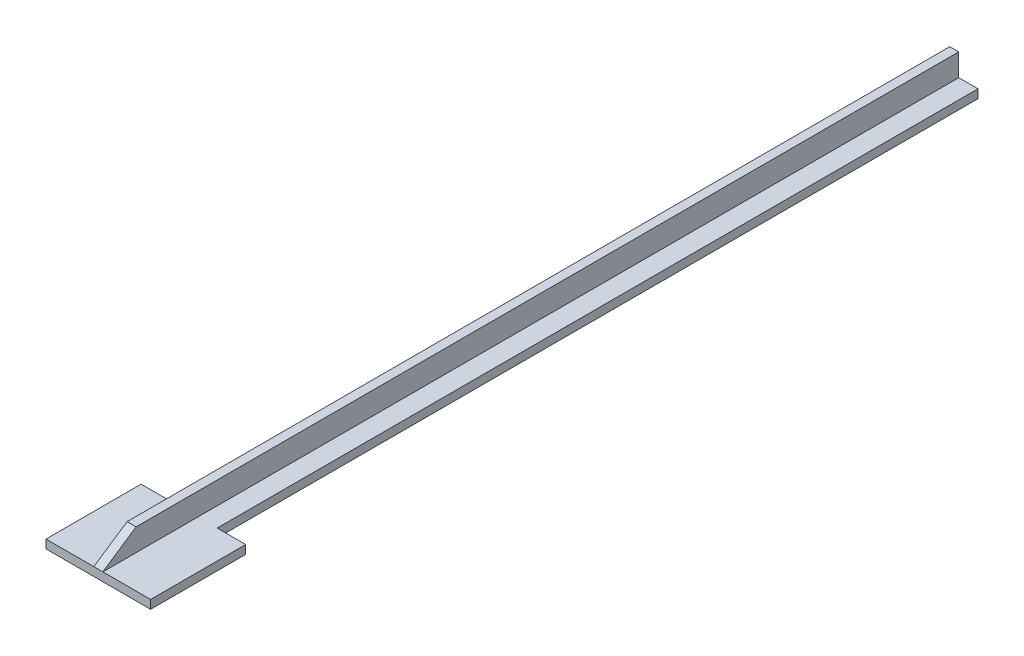
ISO-10303-21;
HEADER;
FILE_DESCRIPTION(('STEP AP214'),'2;1');
FILE_NAME('part.step','',(''),(''),'','','');
FILE_SCHEMA(('AUTOMOTIVE_DESIGN { 1 0 10303 214 1 1 1 1 }'));
ENDSEC;
DATA;
#1=APPLICATION_CONTEXT('core data for automotive mechanical design processes');
#2=APPLICATION_PROTOCOL_DEFINITION('international standard','automotive_design',2000,#1);
#3=PRODUCT_CONTEXT('',#1,'mechanical');
#4=PRODUCT('Part','Part','',(#3));
#5=PRODUCT_RELATED_PRODUCT_CATEGORY('part','',(#4));
#6=PRODUCT_DEFINITION_FORMATION('','',#4);
#7=PRODUCT_DEFINITION_CONTEXT('part definition',#1,'design');
#8=PRODUCT_DEFINITION('design','',#6,#7);
#9=PRODUCT_DEFINITION_SHAPE('','',#8);
#10=(LENGTH_UNIT() NAMED_UNIT(*) SI_UNIT(.MILLI.,.METRE.));
#11=(NAMED_UNIT(*) PLANE_ANGLE_UNIT() SI_UNIT($,.RADIAN.));
#12=(NAMED_UNIT(*) SI_UNIT($,.STERADIAN.) SOLID_ANGLE_UNIT());
#13=UNCERTAINTY_MEASURE_WITH_UNIT(LENGTH_MEASURE(1.E-05),#10,'distance_accuracy_value','');
#14=(GEOMETRIC_REPRESENTATION_CONTEXT(3) GLOBAL_UNCERTAINTY_ASSIGNED_CONTEXT((#13)) GLOBAL_UNIT_ASSIGNED_CONTEXT((#10,
#11,#12)) REPRESENTATION_CONTEXT('',''));
#15=CARTESIAN_POINT('',(0.,0.,0.));
#16=DIRECTION('',(0.,0.,1.));
#17=DIRECTION('',(1.,0.,0.));
#18=AXIS2_PLACEMENT_3D('',#15,#16,#17);
#19=CARTESIAN_POINT('',(10.,0.,180.));
#20=DIRECTION('',(-1.,0.,0.));
#21=DIRECTION('',(0.,0.,1.));
#22=AXIS2_PLACEMENT_3D('',#19,#20,#21);
#23=PLANE('',#22);
#24=DIRECTION('',(0.,1.,0.));
#25=VECTOR('',#24,1.);
#26=CARTESIAN_POINT('',(10.,0.,160.));
#27=LINE('',#26,#25);
#28=CARTESIAN_POINT('',(10.,0.,160.));
#29=VERTEX_POINT('',#28);
#30=CARTESIAN_POINT('',(10.,1.8,160.));
#31=VERTEX_POINT('',#30);
#32=EDGE_CURVE('E162',#29,#31,#27,.T.);
#33=ORIENTED_EDGE('',*,*,#32,.F.);
#34=DIRECTION('',(0.,0.,-1.));
#35=VECTOR('',#34,1.);
#36=CARTESIAN_POINT('',(10.,0.,180.));
#37=LINE('',#36,#35);
#38=CARTESIAN_POINT('',(10.,0.,0.));
#39=VERTEX_POINT('',#38);
#40=EDGE_CURVE('E208',#29,#39,#37,.T.);
#41=ORIENTED_EDGE('',*,*,#40,.T.);
#42=DIRECTION('',(0.,1.,0.));
#43=VECTOR('',#42,1.);
#44=CARTESIAN_POINT('',(10.,0.,0.));
#45=LINE('',#44,#43);
#46=CARTESIAN_POINT('',(10.,1.8,0.));
#47=VERTEX_POINT('',#46);
#48=EDGE_CURVE('E176',#39,#47,#45,.T.);
#49=ORIENTED_EDGE('',*,*,#48,.T.);
#50=DIRECTION('',(0.,0.,-1.));
#51=VECTOR('',#50,1.);
#52=CARTESIAN_POINT('',(10.,1.8,180.));
#53=LINE('',#52,#51);
#54=EDGE_CURVE('E206',#31,#47,#53,.T.);
#55=ORIENTED_EDGE('',*,*,#54,.F.);
#56=EDGE_LOOP('',(#33,#41,#49,#55));
#57=FACE_BOUND('',#56,.T.);
#58=ADVANCED_FACE('F35',(#57),#23,.F.);
#59=CARTESIAN_POINT('',(0.,0.,180.));
#60=DIRECTION('',(-1.,0.,0.));
#61=DIRECTION('',(0.,0.,1.));
#62=AXIS2_PLACEMENT_3D('',#59,#60,#61);
#63=PLANE('',#62);
#64=DIRECTION('',(0.,0.,-1.));
#65=VECTOR('',#64,1.);
#66=CARTESIAN_POINT('',(0.,0.,180.));
#67=LINE('',#66,#65);
#68=CARTESIAN_POINT('',(0.,0.,160.));
#69=VERTEX_POINT('',#68);
#70=CARTESIAN_POINT('',(0.,0.,0.));
#71=VERTEX_POINT('',#70);
#72=EDGE_CURVE('E194',#69,#71,#67,.T.);
#73=ORIENTED_EDGE('',*,*,#72,.F.);
#74=DIRECTION('',(0.,1.,0.));
#75=VECTOR('',#74,1.);
#76=CARTESIAN_POINT('',(0.,0.,160.));
#77=LINE('',#76,#75);
#78=CARTESIAN_POINT('',(0.,1.8,160.));
#79=VERTEX_POINT('',#78);
#80=EDGE_CURVE('E141',#69,#79,#77,.T.);
#81=ORIENTED_EDGE('',*,*,#80,.T.);
#82=DIRECTION('',(0.,0.,-1.));
#83=VECTOR('',#82,1.);
#84=CARTESIAN_POINT('',(0.,1.8,180.));
#85=LINE('',#84,#83);
#86=CARTESIAN_POINT('',(0.,1.8,0.));
#87=VERTEX_POINT('',#86);
#88=EDGE_CURVE('E196',#79,#87,#85,.T.);
#89=ORIENTED_EDGE('',*,*,#88,.T.);
#90=DIRECTION('',(0.,1.,0.));
#91=VECTOR('',#90,1.);
#92=CARTESIAN_POINT('',(0.,0.,0.));
#93=LINE('',#92,#91);
#94=EDGE_CURVE('E171',#71,#87,#93,.T.);
#95=ORIENTED_EDGE('',*,*,#94,.F.);
#96=EDGE_LOOP('',(#73,#81,#89,#95));
#97=FACE_BOUND('',#96,.T.);
#98=ADVANCED_FACE('F256',(#97),#63,.T.);
#99=CARTESIAN_POINT('',(0.,0.,180.));
#100=DIRECTION('',(0.,1.,0.));
#101=DIRECTION('',(0.,0.,1.));
#102=AXIS2_PLACEMENT_3D('',#99,#100,#101);
#103=PLANE('',#102);
#104=DIRECTION('',(1.,0.,0.));
#105=VECTOR('',#104,1.);
#106=CARTESIAN_POINT('',(0.,0.,180.));
#107=LINE('',#106,#105);
#108=CARTESIAN_POINT('',(-6.,0.,180.));
#109=VERTEX_POINT('',#108);
#110=CARTESIAN_POINT('',(16.,0.,180.));
#111=VERTEX_POINT('',#110);
#112=EDGE_CURVE('E127',#109,#111,#107,.T.);
#113=ORIENTED_EDGE('',*,*,#112,.F.);
#114=DIRECTION('',(0.,0.,1.));
#115=VECTOR('',#114,1.);
#116=CARTESIAN_POINT('',(-6.,0.,160.));
#117=LINE('',#116,#115);
#118=CARTESIAN_POINT('',(-6.,0.,160.));
#119=VERTEX_POINT('',#118);
#120=EDGE_CURVE('E122',#119,#109,#117,.T.);
#121=ORIENTED_EDGE('',*,*,#120,.F.);
#122=DIRECTION('',(1.,0.,0.));
#123=VECTOR('',#122,1.);
#124=CARTESIAN_POINT('',(-6.,0.,160.));
#125=LINE('',#124,#123);
#126=EDGE_CURVE('E125',#119,#69,#125,.T.);
#127=ORIENTED_EDGE('',*,*,#126,.T.);
#128=ORIENTED_EDGE('',*,*,#72,.T.);
#129=DIRECTION('',(1.,0.,0.));
#130=VECTOR('',#129,1.);
#131=CARTESIAN_POINT('',(0.,0.,0.));
#132=LINE('',#131,#130);
#133=EDGE_CURVE('E168',#71,#39,#132,.T.);
#134=ORIENTED_EDGE('',*,*,#133,.T.);
#135=ORIENTED_EDGE('',*,*,#40,.F.);
#136=CARTESIAN_POINT('',(16.,0.,160.));
#137=VERTEX_POINT('',#136);
#138=EDGE_CURVE('E143',#29,#137,#125,.T.);
#139=ORIENTED_EDGE('',*,*,#138,.T.);
#140=DIRECTION('',(0.,0.,1.));
#141=VECTOR('',#140,1.);
#142=CARTESIAN_POINT('',(16.,0.,160.));
#143=LINE('',#142,#141);
#144=EDGE_CURVE('E132',#137,#111,#143,.T.);
#145=ORIENTED_EDGE('',*,*,#144,.T.);
#146=EDGE_LOOP('',(#113,#121,#127,#128,#134,#135,#139,#145));
#147=FACE_BOUND('',#146,.T.);
#148=ADVANCED_FACE('F124',(#147),#103,.F.);
#149=CARTESIAN_POINT('',(0.,1.8,180.));
#150=DIRECTION('',(0.,1.,0.));
#151=DIRECTION('',(0.,0.,1.));
#152=AXIS2_PLACEMENT_3D('',#149,#150,#151);
#153=PLANE('',#152);
#154=DIRECTION('',(1.,0.,0.));
#155=VECTOR('',#154,1.);
#156=CARTESIAN_POINT('',(0.,1.8,180.));
#157=LINE('',#156,#155);
#158=CARTESIAN_POINT('',(5.95,1.8,180.));
#159=VERTEX_POINT('',#158);
#160=CARTESIAN_POINT('',(16.,1.8,180.));
#161=VERTEX_POINT('',#160);
#162=EDGE_CURVE('E170',#159,#161,#157,.T.);
#163=ORIENTED_EDGE('',*,*,#162,.T.);
#164=DIRECTION('',(0.,0.,1.));
#165=VECTOR('',#164,1.);
#166=CARTESIAN_POINT('',(16.,1.8,160.));
#167=LINE('',#166,#165);
#168=CARTESIAN_POINT('',(16.,1.8,160.));
#169=VERTEX_POINT('',#168);
#170=EDGE_CURVE('E163',#169,#161,#167,.T.);
#171=ORIENTED_EDGE('',*,*,#170,.F.);
#172=DIRECTION('',(-1.,0.,0.));
#173=VECTOR('',#172,1.);
#174=CARTESIAN_POINT('',(-6.,1.8,160.));
#175=LINE('',#174,#173);
#176=EDGE_CURVE('E133',#169,#31,#175,.T.);
#177=ORIENTED_EDGE('',*,*,#176,.T.);
#178=ORIENTED_EDGE('',*,*,#54,.T.);
#179=DIRECTION('',(1.,0.,0.));
#180=VECTOR('',#179,1.);
#181=CARTESIAN_POINT('',(0.,1.8,0.));
#182=LINE('',#181,#180);
#183=CARTESIAN_POINT('',(5.95,1.8,0.));
#184=VERTEX_POINT('',#183);
#185=EDGE_CURVE('E179',#184,#47,#182,.T.);
#186=ORIENTED_EDGE('',*,*,#185,.F.);
#187=DIRECTION('',(0.,0.,-1.));
#188=VECTOR('',#187,1.);
#189=CARTESIAN_POINT('',(5.95,1.8,180.));
#190=LINE('',#189,#188);
#191=EDGE_CURVE('E204',#159,#184,#190,.T.);
#192=ORIENTED_EDGE('',*,*,#191,.F.);
#193=EDGE_LOOP('',(#163,#171,#177,#178,#186,#192));
#194=FACE_BOUND('',#193,.T.);
#195=ADVANCED_FACE('F236',(#194),#153,.T.);
#196=CARTESIAN_POINT('',(5.95,0.,180.));
#197=DIRECTION('',(-1.,0.,0.));
#198=DIRECTION('',(0.,0.,1.));
#199=AXIS2_PLACEMENT_3D('',#196,#197,#198);
#200=PLANE('',#199);
#201=DIRECTION('',(0.,0.,-1.));
#202=VECTOR('',#201,1.);
#203=CARTESIAN_POINT('',(5.95,6.5,180.));
#204=LINE('',#203,#202);
#205=CARTESIAN_POINT('',(5.95,6.5,173.));
#206=VERTEX_POINT('',#205);
#207=CARTESIAN_POINT('',(5.95,6.5,0.));
#208=VERTEX_POINT('',#207);
#209=EDGE_CURVE('E202',#206,#208,#204,.T.);
#210=ORIENTED_EDGE('',*,*,#209,.F.);
#211=DIRECTION('',(0.,-0.557434187884018,0.830221130891093));
#212=VECTOR('',#211,1.);
#213=CARTESIAN_POINT('',(5.95,1.79999999999999,180.));
#214=LINE('',#213,#212);
#215=EDGE_CURVE('E11',#206,#159,#214,.T.);
#216=ORIENTED_EDGE('',*,*,#215,.T.);
#217=ORIENTED_EDGE('',*,*,#191,.T.);
#218=DIRECTION('',(0.,1.,0.));
#219=VECTOR('',#218,1.);
#220=CARTESIAN_POINT('',(5.95,0.,0.));
#221=LINE('',#220,#219);
#222=EDGE_CURVE('E182',#184,#208,#221,.T.);
#223=ORIENTED_EDGE('',*,*,#222,.T.);
#224=EDGE_LOOP('',(#210,#216,#217,#223));
#225=FACE_BOUND('',#224,.T.);
#226=ADVANCED_FACE('F242',(#225),#200,.F.);
#227=CARTESIAN_POINT('',(0.,6.5,180.));
#228=DIRECTION('',(0.,-1.,0.));
#229=DIRECTION('',(0.,0.,-1.));
#230=AXIS2_PLACEMENT_3D('',#227,#228,#229);
#231=PLANE('',#230);
#232=DIRECTION('',(0.,0.,-1.));
#233=VECTOR('',#232,1.);
#234=CARTESIAN_POINT('',(4.05,6.5,180.));
#235=LINE('',#234,#233);
#236=CARTESIAN_POINT('',(4.05,6.5,173.));
#237=VERTEX_POINT('',#236);
#238=CARTESIAN_POINT('',(4.05,6.5,0.));
#239=VERTEX_POINT('',#238);
#240=EDGE_CURVE('E200',#237,#239,#235,.T.);
#241=ORIENTED_EDGE('',*,*,#240,.F.);
#242=DIRECTION('',(1.,0.,0.));
#243=VECTOR('',#242,1.);
#244=CARTESIAN_POINT('',(5.95,6.5,173.));
#245=LINE('',#244,#243);
#246=EDGE_CURVE('E43',#237,#206,#245,.T.);
#247=ORIENTED_EDGE('',*,*,#246,.T.);
#248=ORIENTED_EDGE('',*,*,#209,.T.);
#249=DIRECTION('',(-1.,0.,0.));
#250=VECTOR('',#249,1.);
#251=CARTESIAN_POINT('',(0.,6.5,0.));
#252=LINE('',#251,#250);
#253=EDGE_CURVE('E186',#208,#239,#252,.T.);
#254=ORIENTED_EDGE('',*,*,#253,.T.);
#255=EDGE_LOOP('',(#241,#247,#248,#254));
#256=FACE_BOUND('',#255,.T.);
#257=ADVANCED_FACE('F248',(#256),#231,.F.);
#258=CARTESIAN_POINT('',(4.05,0.,180.));
#259=DIRECTION('',(-1.,0.,0.));
#260=DIRECTION('',(0.,0.,1.));
#261=AXIS2_PLACEMENT_3D('',#258,#259,#260);
#262=PLANE('',#261);
#263=DIRECTION('',(0.,0.,-1.));
#264=VECTOR('',#263,1.);
#265=CARTESIAN_POINT('',(4.05,1.8,180.));
#266=LINE('',#265,#264);
#267=CARTESIAN_POINT('',(4.05,1.8,180.));
#268=VERTEX_POINT('',#267);
#269=CARTESIAN_POINT('',(4.05,1.8,0.));
#270=VERTEX_POINT('',#269);
#271=EDGE_CURVE('E198',#268,#270,#266,.T.);
#272=ORIENTED_EDGE('',*,*,#271,.F.);
#273=DIRECTION('',(0.,0.557434187884018,-0.830221130891093));
#274=VECTOR('',#273,1.);
#275=CARTESIAN_POINT('',(4.05,1.24068082712055,180.833028555352));
#276=LINE('',#275,#274);
#277=EDGE_CURVE('E57',#268,#237,#276,.T.);
#278=ORIENTED_EDGE('',*,*,#277,.T.);
#279=ORIENTED_EDGE('',*,*,#240,.T.);
#280=DIRECTION('',(0.,1.,0.));
#281=VECTOR('',#280,1.);
#282=CARTESIAN_POINT('',(4.05,0.,0.));
#283=LINE('',#282,#281);
#284=EDGE_CURVE('E189',#270,#239,#283,.T.);
#285=ORIENTED_EDGE('',*,*,#284,.F.);
#286=EDGE_LOOP('',(#272,#278,#279,#285));
#287=FACE_BOUND('',#286,.T.);
#288=ADVANCED_FACE('F222',(#287),#262,.T.);
#289=ORIENTED_EDGE('',*,*,#271,.T.);
#290=EDGE_CURVE('E183',#87,#270,#182,.T.);
#291=ORIENTED_EDGE('',*,*,#290,.F.);
#292=ORIENTED_EDGE('',*,*,#88,.F.);
#293=CARTESIAN_POINT('',(-6.,1.8,160.));
#294=VERTEX_POINT('',#293);
#295=EDGE_CURVE('E157',#79,#294,#175,.T.);
#296=ORIENTED_EDGE('',*,*,#295,.T.);
#297=DIRECTION('',(0.,0.,1.));
#298=VECTOR('',#297,1.);
#299=CARTESIAN_POINT('',(-6.,1.8,160.));
#300=LINE('',#299,#298);
#301=CARTESIAN_POINT('',(-6.,1.8,180.));
#302=VERTEX_POINT('',#301);
#303=EDGE_CURVE('E148',#294,#302,#300,.T.);
#304=ORIENTED_EDGE('',*,*,#303,.T.);
#305=EDGE_CURVE('E173',#302,#268,#157,.T.);
#306=ORIENTED_EDGE('',*,*,#305,.T.);
#307=EDGE_LOOP('',(#289,#291,#292,#296,#304,#306));
#308=FACE_BOUND('',#307,.T.);
#309=ADVANCED_FACE('F226',(#308),#153,.T.);
#310=CARTESIAN_POINT('',(0.,0.,180.));
#311=DIRECTION('',(0.,0.,1.));
#312=DIRECTION('',(1.,0.,0.));
#313=AXIS2_PLACEMENT_3D('',#310,#311,#312);
#314=PLANE('',#313);
#315=ORIENTED_EDGE('',*,*,#162,.F.);
#316=DIRECTION('',(-1.,0.,0.));
#317=VECTOR('',#316,1.);
#318=CARTESIAN_POINT('',(4.05,1.79999999999999,180.));
#319=LINE('',#318,#317);
#320=EDGE_CURVE('E211',#159,#268,#319,.T.);
#321=ORIENTED_EDGE('',*,*,#320,.T.);
#322=ORIENTED_EDGE('',*,*,#305,.F.);
#323=DIRECTION('',(0.,-1.,0.));
#324=VECTOR('',#323,1.);
#325=CARTESIAN_POINT('',(-6.,1.8,180.));
#326=LINE('',#325,#324);
#327=EDGE_CURVE('E152',#302,#109,#326,.T.);
#328=ORIENTED_EDGE('',*,*,#327,.T.);
#329=ORIENTED_EDGE('',*,*,#112,.T.);
#330=DIRECTION('',(0.,1.,0.));
#331=VECTOR('',#330,1.);
#332=CARTESIAN_POINT('',(16.,1.8,180.));
#333=LINE('',#332,#331);
#334=EDGE_CURVE('E149',#111,#161,#333,.T.);
#335=ORIENTED_EDGE('',*,*,#334,.T.);
#336=EDGE_LOOP('',(#315,#321,#322,#328,#329,#335));
#337=FACE_BOUND('',#336,.T.);
#338=ADVANCED_FACE('F217',(#337),#314,.T.);
#339=CARTESIAN_POINT('',(0.,0.,0.));
#340=DIRECTION('',(0.,0.,1.));
#341=DIRECTION('',(1.,0.,0.));
#342=AXIS2_PLACEMENT_3D('',#339,#340,#341);
#343=PLANE('',#342);
#344=ORIENTED_EDGE('',*,*,#133,.F.);
#345=ORIENTED_EDGE('',*,*,#94,.T.);
#346=ORIENTED_EDGE('',*,*,#290,.T.);
#347=ORIENTED_EDGE('',*,*,#284,.T.);
#348=ORIENTED_EDGE('',*,*,#253,.F.);
#349=ORIENTED_EDGE('',*,*,#222,.F.);
#350=ORIENTED_EDGE('',*,*,#185,.T.);
#351=ORIENTED_EDGE('',*,*,#48,.F.);
#352=EDGE_LOOP('',(#344,#345,#346,#347,#348,#349,#350,#351));
#353=FACE_BOUND('',#352,.T.);
#354=ADVANCED_FACE('F246',(#353),#343,.F.);
#355=CARTESIAN_POINT('',(-6.,1.8,160.));
#356=DIRECTION('',(-1.,0.,0.));
#357=DIRECTION('',(0.,-1.,0.));
#358=AXIS2_PLACEMENT_3D('',#355,#356,#357);
#359=PLANE('',#358);
#360=ORIENTED_EDGE('',*,*,#327,.F.);
#361=ORIENTED_EDGE('',*,*,#303,.F.);
#362=DIRECTION('',(0.,-1.,0.));
#363=VECTOR('',#362,1.);
#364=CARTESIAN_POINT('',(-6.,1.8,160.));
#365=LINE('',#364,#363);
#366=EDGE_CURVE('E140',#294,#119,#365,.T.);
#367=ORIENTED_EDGE('',*,*,#366,.T.);
#368=ORIENTED_EDGE('',*,*,#120,.T.);
#369=EDGE_LOOP('',(#360,#361,#367,#368));
#370=FACE_BOUND('',#369,.T.);
#371=ADVANCED_FACE('F146',(#370),#359,.T.);
#372=CARTESIAN_POINT('',(0.,0.,160.));
#373=DIRECTION('',(0.,0.,1.));
#374=DIRECTION('',(1.,0.,0.));
#375=AXIS2_PLACEMENT_3D('',#372,#373,#374);
#376=PLANE('',#375);
#377=ORIENTED_EDGE('',*,*,#80,.F.);
#378=ORIENTED_EDGE('',*,*,#126,.F.);
#379=ORIENTED_EDGE('',*,*,#366,.F.);
#380=ORIENTED_EDGE('',*,*,#295,.F.);
#381=EDGE_LOOP('',(#377,#378,#379,#380));
#382=FACE_BOUND('',#381,.T.);
#383=ADVANCED_FACE('F138',(#382),#376,.F.);
#384=ORIENTED_EDGE('',*,*,#138,.F.);
#385=ORIENTED_EDGE('',*,*,#32,.T.);
#386=ORIENTED_EDGE('',*,*,#176,.F.);
#387=DIRECTION('',(0.,1.,0.));
#388=VECTOR('',#387,1.);
#389=CARTESIAN_POINT('',(16.,1.8,160.));
#390=LINE('',#389,#388);
#391=EDGE_CURVE('E142',#137,#169,#390,.T.);
#392=ORIENTED_EDGE('',*,*,#391,.F.);
#393=EDGE_LOOP('',(#384,#385,#386,#392));
#394=FACE_BOUND('',#393,.T.);
#395=ADVANCED_FACE('F253',(#394),#376,.F.);
#396=CARTESIAN_POINT('',(16.,1.8,160.));
#397=DIRECTION('',(1.,0.,0.));
#398=DIRECTION('',(0.,0.,-1.));
#399=AXIS2_PLACEMENT_3D('',#396,#397,#398);
#400=PLANE('',#399);
#401=ORIENTED_EDGE('',*,*,#334,.F.);
#402=ORIENTED_EDGE('',*,*,#144,.F.);
#403=ORIENTED_EDGE('',*,*,#391,.T.);
#404=ORIENTED_EDGE('',*,*,#170,.T.);
#405=EDGE_LOOP('',(#401,#402,#403,#404));
#406=FACE_BOUND('',#405,.T.);
#407=ADVANCED_FACE('F233',(#406),#400,.T.);
#408=CARTESIAN_POINT('',(0.,1.79999999999999,180.));
#409=DIRECTION('',(0.,0.830221130891093,0.557434187884018));
#410=DIRECTION('',(1.,0.,0.));
#411=AXIS2_PLACEMENT_3D('',#408,#409,#410);
#412=PLANE('',#411);
#413=ORIENTED_EDGE('',*,*,#215,.F.);
#414=ORIENTED_EDGE('',*,*,#246,.F.);
#415=ORIENTED_EDGE('',*,*,#277,.F.);
#416=ORIENTED_EDGE('',*,*,#320,.F.);
#417=EDGE_LOOP('',(#413,#414,#415,#416));
#418=FACE_BOUND('',#417,.T.);
#419=ADVANCED_FACE('F37',(#418),#412,.T.);
#420=CLOSED_SHELL('',(#58,#98,#148,#195,#226,#257,#288,#309,#338,#354,#371,#383,#395,#407,#419));
#421=MANIFOLD_SOLID_BREP('B2',#420);
#422=ADVANCED_BREP_SHAPE_REPRESENTATION('',(#18,#421),#14);
#423=SHAPE_DEFINITION_REPRESENTATION(#9,#422);
ENDSEC;
END-ISO-10303-21;
